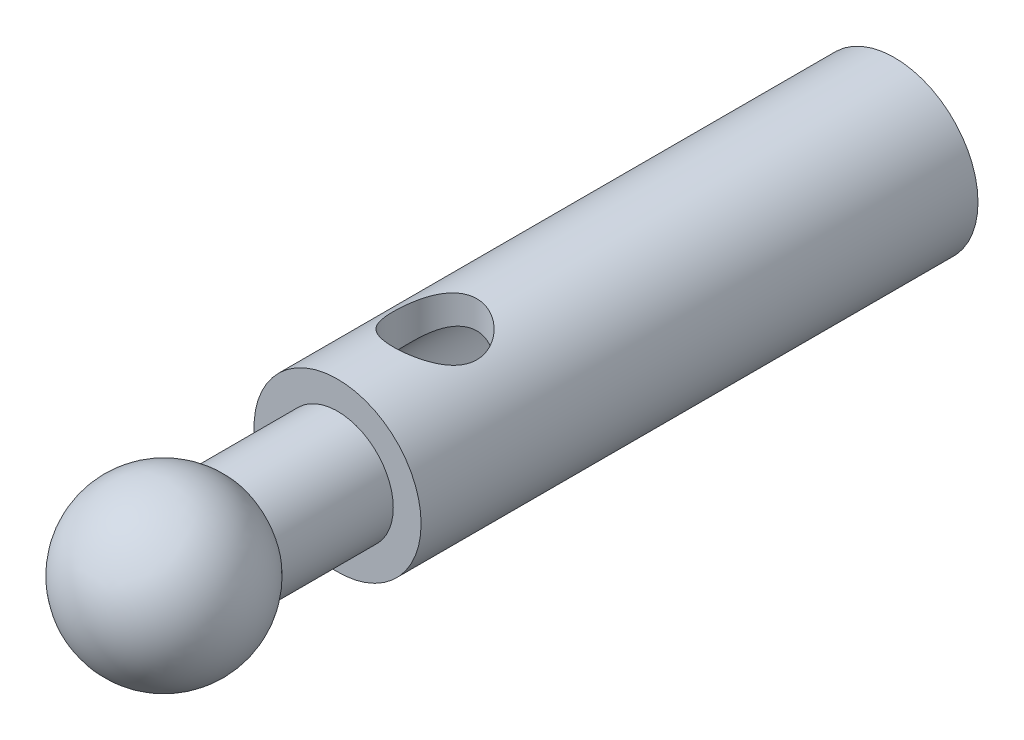
ISO-10303-21;
HEADER;
FILE_DESCRIPTION(('STEP AP214'),'2;1');
FILE_NAME('part.step','',(''),(''),'','','');
FILE_SCHEMA(('AUTOMOTIVE_DESIGN { 1 0 10303 214 1 1 1 1 }'));
ENDSEC;
DATA;
#1=APPLICATION_CONTEXT('core data for automotive mechanical design processes');
#2=APPLICATION_PROTOCOL_DEFINITION('international standard','automotive_design',2000,#1);
#3=PRODUCT_CONTEXT('',#1,'mechanical');
#4=PRODUCT('Part','Part','',(#3));
#5=PRODUCT_RELATED_PRODUCT_CATEGORY('part','',(#4));
#6=PRODUCT_DEFINITION_FORMATION('','',#4);
#7=PRODUCT_DEFINITION_CONTEXT('part definition',#1,'design');
#8=PRODUCT_DEFINITION('design','',#6,#7);
#9=PRODUCT_DEFINITION_SHAPE('','',#8);
#10=(LENGTH_UNIT() NAMED_UNIT(*) SI_UNIT(.MILLI.,.METRE.));
#11=(NAMED_UNIT(*) PLANE_ANGLE_UNIT() SI_UNIT($,.RADIAN.));
#12=(NAMED_UNIT(*) SI_UNIT($,.STERADIAN.) SOLID_ANGLE_UNIT());
#13=UNCERTAINTY_MEASURE_WITH_UNIT(LENGTH_MEASURE(1.E-05),#10,'distance_accuracy_value','');
#14=(GEOMETRIC_REPRESENTATION_CONTEXT(3) GLOBAL_UNCERTAINTY_ASSIGNED_CONTEXT((#13)) GLOBAL_UNIT_ASSIGNED_CONTEXT((#10,
#11,#12)) REPRESENTATION_CONTEXT('',''));
#15=CARTESIAN_POINT('',(0.,0.,0.));
#16=DIRECTION('',(0.,0.,1.));
#17=DIRECTION('',(1.,0.,0.));
#18=AXIS2_PLACEMENT_3D('',#15,#16,#17);
#19=CARTESIAN_POINT('',(0.,0.,6.22880016650845));
#20=DIRECTION('',(0.,0.,1.));
#21=DIRECTION('',(1.,0.,0.));
#22=AXIS2_PLACEMENT_3D('',#19,#20,#21);
#23=CYLINDRICAL_SURFACE('',#22,1.);
#24=CARTESIAN_POINT('',(0.,0.,-8.38923382224144));
#25=DIRECTION('',(0.,0.,1.));
#26=DIRECTION('',(1.,0.,0.));
#27=AXIS2_PLACEMENT_3D('',#24,#25,#26);
#28=CIRCLE('',#27,1.);
#29=CARTESIAN_POINT('',(1.,0.,-8.38923382224144));
#30=VERTEX_POINT('',#29);
#31=EDGE_CURVE('E11',#30,#30,#28,.T.);
#32=ORIENTED_EDGE('',*,*,#31,.F.);
#33=EDGE_LOOP('',(#32));
#34=FACE_BOUND('',#33,.T.);
#35=CARTESIAN_POINT('',(0.,0.,0.610766177758557));
#36=DIRECTION('',(0.,0.,1.));
#37=DIRECTION('',(1.,0.,0.));
#38=AXIS2_PLACEMENT_3D('',#35,#36,#37);
#39=CIRCLE('',#38,1.);
#40=CARTESIAN_POINT('',(0.,-1.,0.610766177758557));
#41=VERTEX_POINT('',#40);
#42=CARTESIAN_POINT('',(0.,1.,0.610766177758557));
#43=VERTEX_POINT('',#42);
#44=EDGE_CURVE('E83',#41,#43,#39,.T.);
#45=ORIENTED_EDGE('',*,*,#44,.T.);
#46=CARTESIAN_POINT('',(0.,1.,0.610766177758557));
#47=CARTESIAN_POINT('',(0.036620214401237,0.99999554992433,0.610761442410487));
#48=CARTESIAN_POINT('',(0.0732831719538218,0.997967650692159,0.60806303813198));
#49=CARTESIAN_POINT('',(0.145465550551889,0.990033614797006,0.59743327507231));
#50=CARTESIAN_POINT('',(0.180981860536907,0.984117727976347,0.589488760040905));
#51=CARTESIAN_POINT('',(0.249618016635632,0.968978221133336,0.56890955602082));
#52=CARTESIAN_POINT('',(0.282750996692573,0.959774718373226,0.556303376073267));
#53=CARTESIAN_POINT('',(0.346210978824909,0.938752824883223,0.526995050552521));
#54=CARTESIAN_POINT('',(0.376538798175683,0.92693519919514,0.510294103187685));
#55=CARTESIAN_POINT('',(0.436733026399873,0.900247710135604,0.47163465827731));
#56=CARTESIAN_POINT('',(0.466296630176022,0.885196539347366,0.449332509399509));
#57=CARTESIAN_POINT('',(0.521513568274129,0.853835092817012,0.401018262775736));
#58=CARTESIAN_POINT('',(0.547160736840209,0.837522891380571,0.375000437432701));
#59=CARTESIAN_POINT('',(0.599185812622843,0.801355617071727,0.313974699827026));
#60=CARTESIAN_POINT('',(0.624652893542544,0.781454274009926,0.278214338856543));
#61=CARTESIAN_POINT('',(0.669309989447193,0.743557223633514,0.202040671915976));
#62=CARTESIAN_POINT('',(0.688508584605922,0.725558934483915,0.161633829331437));
#63=CARTESIAN_POINT('',(0.714403139262061,0.699885775857878,0.091014758372502));
#64=CARTESIAN_POINT('',(0.723128372337556,0.690788755925943,0.0620708291823348));
#65=CARTESIAN_POINT('',(0.737103362769486,0.675857970761134,0.00256981037809932));
#66=CARTESIAN_POINT('',(0.742361076759835,0.670016739542134,-0.0279834111785993));
#67=CARTESIAN_POINT('',(0.749064110723877,0.662518798434897,-0.0903251150070697));
#68=CARTESIAN_POINT('',(0.75047477428221,0.660900133439582,-0.122122225592224));
#69=CARTESIAN_POINT('',(0.749241066198165,0.662297658823726,-0.185541277693482));
#70=CARTESIAN_POINT('',(0.746595240758687,0.665315510876205,-0.217163152330419));
#71=CARTESIAN_POINT('',(0.737988696485992,0.674838116502368,-0.27582949590356));
#72=CARTESIAN_POINT('',(0.732412431994233,0.680935785974532,-0.30300200760013));
#73=CARTESIAN_POINT('',(0.718528355694915,0.695570964919253,-0.355953261437209));
#74=CARTESIAN_POINT('',(0.710217918434355,0.704110818431618,-0.381730636102054));
#75=CARTESIAN_POINT('',(0.685165320811545,0.728708846105991,-0.447362015654333));
#76=CARTESIAN_POINT('',(0.666400742456175,0.746128245598029,-0.485934030588921));
#77=CARTESIAN_POINT('',(0.623090116586356,0.782666490824355,-0.558832084150201));
#78=CARTESIAN_POINT('',(0.59853002128312,0.801789394457195,-0.593147491861789));
#79=CARTESIAN_POINT('',(0.543258020506856,0.840258361538408,-0.658110517450432));
#80=CARTESIAN_POINT('',(0.512406877629168,0.859597933643939,-0.688644125684089));
#81=CARTESIAN_POINT('',(0.445211260855809,0.896240189912108,-0.744365645630127));
#82=CARTESIAN_POINT('',(0.408877527147122,0.913546741320541,-0.769563782356177));
#83=CARTESIAN_POINT('',(0.338951040226877,0.941398630366827,-0.809224221861975));
#84=CARTESIAN_POINT('',(0.306269935092758,0.95260385472467,-0.824826119349432));
#85=CARTESIAN_POINT('',(0.238176086601096,0.971864522085111,-0.851346262473279));
#86=CARTESIAN_POINT('',(0.202765070531897,0.979921937521859,-0.862267441491059));
#87=CARTESIAN_POINT('',(0.129838116241745,0.992227943179847,-0.878860503684691));
#88=CARTESIAN_POINT('',(0.0923106407029679,0.996452964858721,-0.884499911710765));
#89=CARTESIAN_POINT('',(0.0166006198984625,1.00057941829725,-0.890008620927291));
#90=CARTESIAN_POINT('',(-0.0215816421863606,1.00048267422705,-0.889880356589126));
#91=CARTESIAN_POINT('',(-0.0934021086648135,0.996212735879362,-0.884178387604852));
#92=CARTESIAN_POINT('',(-0.127111163773067,0.992450433002005,-0.87915355379711));
#93=CARTESIAN_POINT('',(-0.193055335304559,0.981756601007941,-0.864746932237511));
#94=CARTESIAN_POINT('',(-0.225290136493631,0.974824397536311,-0.85536421739674));
#95=CARTESIAN_POINT('',(-0.288708389844884,0.957999153416568,-0.832290056944894));
#96=CARTESIAN_POINT('',(-0.319814586268068,0.948010251450969,-0.818458231527746));
#97=CARTESIAN_POINT('',(-0.379259263521538,0.925834927059814,-0.78714759452865));
#98=CARTESIAN_POINT('',(-0.407597360668207,0.913648200660337,-0.769668278421579));
#99=CARTESIAN_POINT('',(-0.465755813159512,0.885595734432499,-0.72834219903616));
#100=CARTESIAN_POINT('',(-0.495033381349326,0.869455475125194,-0.703919552522708));
#101=CARTESIAN_POINT('',(-0.549359874279295,0.836194764373917,-0.651229445947259));
#102=CARTESIAN_POINT('',(-0.574399152347978,0.819072192536945,-0.6229534723948));
#103=CARTESIAN_POINT('',(-0.62438770537802,0.78184564145752,-0.557158881760816));
#104=CARTESIAN_POINT('',(-0.648415218243071,0.761793592600651,-0.518905041495127));
#105=CARTESIAN_POINT('',(-0.689616179991865,0.724702956742107,-0.437553783255385));
#106=CARTESIAN_POINT('',(-0.706810002579291,0.707655497854298,-0.394471261287782));
#107=CARTESIAN_POINT('',(-0.7280786712828,0.685594389043249,-0.321526597803825));
#108=CARTESIAN_POINT('',(-0.734655047561808,0.678479059123849,-0.293038259039086));
#109=CARTESIAN_POINT('',(-0.744457610912695,0.667710280514031,-0.234880298751018));
#110=CARTESIAN_POINT('',(-0.747691276007806,0.664049106097414,-0.205213468844592));
#111=CARTESIAN_POINT('',(-0.750576601033655,0.660788008964816,-0.145319282331485));
#112=CARTESIAN_POINT('',(-0.750210076582722,0.661208703438971,-0.115089850720612));
#113=CARTESIAN_POINT('',(-0.74588441923474,0.666082242704223,-0.0552054028814332));
#114=CARTESIAN_POINT('',(-0.741920650285916,0.670540290734721,-0.0255511783528203));
#115=CARTESIAN_POINT('',(-0.729469208900038,0.684086744053067,0.0387234635370604));
#116=CARTESIAN_POINT('',(-0.720182838954333,0.693973530017118,0.0730147681254315));
#117=CARTESIAN_POINT('',(-0.697348137148892,0.716914816662479,0.139033601872546));
#118=CARTESIAN_POINT('',(-0.683789039566413,0.729977299739552,0.170754397644588));
#119=CARTESIAN_POINT('',(-0.647494590522783,0.762582387984413,0.242026494527841));
#120=CARTESIAN_POINT('',(-0.62320769235656,0.782801021766623,0.280476975753205));
#121=CARTESIAN_POINT('',(-0.568253610319043,0.823567545090072,0.35232919362465));
#122=CARTESIAN_POINT('',(-0.53758074162965,0.844115712838232,0.385726385757233));
#123=CARTESIAN_POINT('',(-0.469813504073434,0.883644966812503,0.447182124079668));
#124=CARTESIAN_POINT('',(-0.432668324359604,0.902611751461283,0.475194431847497));
#125=CARTESIAN_POINT('',(-0.352579805271569,0.936786365634489,0.524377609158534));
#126=CARTESIAN_POINT('',(-0.309650664114992,0.952003149546711,0.545564813866366));
#127=CARTESIAN_POINT('',(-0.232419470733685,0.973183741180645,0.574666136544611));
#128=CARTESIAN_POINT('',(-0.199274632668579,0.980552315625431,0.584650344057896));
#129=CARTESIAN_POINT('',(-0.131422973804691,0.99191799869998,0.59997433070259));
#130=CARTESIAN_POINT('',(-0.0967208035042921,0.995924522226517,0.605327080822991));
#131=CARTESIAN_POINT('',(-0.0412269601856738,0.999363449511956,0.609917446258469));
#132=CARTESIAN_POINT('',(-0.0206202562409953,1.00000250576634,0.610768844157216));
#133=CARTESIAN_POINT('',(0.,1.,0.610766177758557));
#134=B_SPLINE_CURVE_WITH_KNOTS('',3,(#46,#47,#48,#49,#50,#51,#52,#53,#54,#55,#56,#57,#58,#59,
#60,#61,#62,#63,#64,#65,#66,#67,#68,#69,#70,#71,#72,#73,#74,#75,#76,#77,#78,#79,#80,#81,#82,#83,
#84,#85,#86,#87,#88,#89,#90,#91,#92,#93,#94,#95,#96,#97,#98,#99,#100,#101,#102,#103,#104,#105,
#106,#107,#108,#109,#110,#111,#112,#113,#114,#115,#116,#117,#118,#119,#120,#121,#122,#123,#124,
#125,#126,#127,#128,#129,#130,#131,#132,#133),.UNSPECIFIED.,.T.,.F.,(4,2,2,2,2,2,2,2,2,2,2,2,2,
2,2,2,2,2,2,2,2,2,2,2,2,2,2,2,2,2,2,2,2,2,2,2,2,2,2,2,2,2,2,4),(0.,0.109785893286021,
0.219848159711622,0.329248166786691,0.438616199424647,0.558112156587149,0.677794342025813,
0.821800079437256,0.965607870282534,1.05999759264951,1.15416996597645,1.24918793810628,
1.34423997150105,1.42913445078177,1.51411068794507,1.65224665897142,1.79072096173131,
1.93267941963232,2.07436331241032,2.18763252497381,2.30083064815745,2.41472029077636,
2.52856186227493,2.63095593500184,2.73337180087093,2.83940219736027,2.94544726982957,
3.06920191035121,3.19323454486913,3.3408429800216,3.48800797919243,3.57794580705653,
3.66768199551291,3.75787166921557,3.84817774276114,3.95819835474254,4.06849842564148,
4.21706123322071,4.36575686189633,4.51567724740512,4.66523610130769,4.77097848765002,
4.87642376135815,4.93824243959964),.UNSPECIFIED.);
#135=EDGE_CURVE('E49',#43,#43,#134,.T.);
#136=ORIENTED_EDGE('',*,*,#135,.T.);
#137=EDGE_CURVE('E84',#43,#41,#39,.T.);
#138=ORIENTED_EDGE('',*,*,#137,.T.);
#139=CARTESIAN_POINT('',(0.,-1.,0.610766177758557));
#140=CARTESIAN_POINT('',(-0.036620214401237,-0.99999554992433,0.610761442410487));
#141=CARTESIAN_POINT('',(-0.0732831719538218,-0.997967650692159,0.60806303813198));
#142=CARTESIAN_POINT('',(-0.145465550551889,-0.990033614797006,0.59743327507231));
#143=CARTESIAN_POINT('',(-0.180981860536907,-0.984117727976347,0.589488760040905));
#144=CARTESIAN_POINT('',(-0.249618016635632,-0.968978221133336,0.56890955602082));
#145=CARTESIAN_POINT('',(-0.282750996692573,-0.959774718373226,0.556303376073267));
#146=CARTESIAN_POINT('',(-0.346210978824909,-0.938752824883223,0.526995050552521));
#147=CARTESIAN_POINT('',(-0.376538798175683,-0.92693519919514,0.510294103187685));
#148=CARTESIAN_POINT('',(-0.436733026399873,-0.900247710135604,0.47163465827731));
#149=CARTESIAN_POINT('',(-0.466296630176022,-0.885196539347366,0.449332509399509));
#150=CARTESIAN_POINT('',(-0.521513568274129,-0.853835092817012,0.401018262775736));
#151=CARTESIAN_POINT('',(-0.547160736840209,-0.837522891380571,0.375000437432701));
#152=CARTESIAN_POINT('',(-0.599185812622843,-0.801355617071727,0.313974699827026));
#153=CARTESIAN_POINT('',(-0.624652893542544,-0.781454274009926,0.278214338856543));
#154=CARTESIAN_POINT('',(-0.669309989447193,-0.743557223633514,0.202040671915976));
#155=CARTESIAN_POINT('',(-0.688508584605922,-0.725558934483915,0.161633829331437));
#156=CARTESIAN_POINT('',(-0.714403139262061,-0.699885775857878,0.091014758372502));
#157=CARTESIAN_POINT('',(-0.723128372337556,-0.690788755925943,0.0620708291823348));
#158=CARTESIAN_POINT('',(-0.737103362769486,-0.675857970761134,0.00256981037809932));
#159=CARTESIAN_POINT('',(-0.742361076759835,-0.670016739542134,-0.0279834111785993));
#160=CARTESIAN_POINT('',(-0.749064110723877,-0.662518798434897,-0.0903251150070697));
#161=CARTESIAN_POINT('',(-0.75047477428221,-0.660900133439582,-0.122122225592224));
#162=CARTESIAN_POINT('',(-0.749241066198165,-0.662297658823726,-0.185541277693482));
#163=CARTESIAN_POINT('',(-0.746595240758687,-0.665315510876205,-0.217163152330419));
#164=CARTESIAN_POINT('',(-0.737988696485992,-0.674838116502368,-0.27582949590356));
#165=CARTESIAN_POINT('',(-0.732412431994233,-0.680935785974532,-0.30300200760013));
#166=CARTESIAN_POINT('',(-0.718528355694915,-0.695570964919253,-0.355953261437209));
#167=CARTESIAN_POINT('',(-0.710217918434355,-0.704110818431618,-0.381730636102054));
#168=CARTESIAN_POINT('',(-0.685165320811545,-0.728708846105991,-0.447362015654333));
#169=CARTESIAN_POINT('',(-0.666400742456175,-0.746128245598029,-0.485934030588921));
#170=CARTESIAN_POINT('',(-0.623090116586356,-0.782666490824355,-0.558832084150201));
#171=CARTESIAN_POINT('',(-0.59853002128312,-0.801789394457195,-0.593147491861789));
#172=CARTESIAN_POINT('',(-0.543258020506856,-0.840258361538408,-0.658110517450432));
#173=CARTESIAN_POINT('',(-0.512406877629168,-0.859597933643939,-0.688644125684089));
#174=CARTESIAN_POINT('',(-0.445211260855809,-0.896240189912108,-0.744365645630127));
#175=CARTESIAN_POINT('',(-0.408877527147122,-0.913546741320541,-0.769563782356177));
#176=CARTESIAN_POINT('',(-0.338951040226877,-0.941398630366827,-0.809224221861975));
#177=CARTESIAN_POINT('',(-0.306269935092758,-0.95260385472467,-0.824826119349432));
#178=CARTESIAN_POINT('',(-0.238176086601096,-0.971864522085111,-0.851346262473279));
#179=CARTESIAN_POINT('',(-0.202765070531897,-0.979921937521859,-0.862267441491059));
#180=CARTESIAN_POINT('',(-0.129838116241745,-0.992227943179847,-0.878860503684691));
#181=CARTESIAN_POINT('',(-0.0923106407029679,-0.996452964858721,-0.884499911710765));
#182=CARTESIAN_POINT('',(-0.0166006198984625,-1.00057941829725,-0.890008620927291));
#183=CARTESIAN_POINT('',(0.0215816421863606,-1.00048267422705,-0.889880356589126));
#184=CARTESIAN_POINT('',(0.0934021086648135,-0.996212735879362,-0.884178387604852));
#185=CARTESIAN_POINT('',(0.127111163773067,-0.992450433002005,-0.87915355379711));
#186=CARTESIAN_POINT('',(0.193055335304559,-0.981756601007941,-0.864746932237511));
#187=CARTESIAN_POINT('',(0.225290136493631,-0.974824397536311,-0.85536421739674));
#188=CARTESIAN_POINT('',(0.288708389844884,-0.957999153416568,-0.832290056944894));
#189=CARTESIAN_POINT('',(0.319814586268068,-0.948010251450969,-0.818458231527746));
#190=CARTESIAN_POINT('',(0.379259263521538,-0.925834927059814,-0.78714759452865));
#191=CARTESIAN_POINT('',(0.407597360668207,-0.913648200660337,-0.769668278421579));
#192=CARTESIAN_POINT('',(0.465755813159512,-0.885595734432499,-0.72834219903616));
#193=CARTESIAN_POINT('',(0.495033381349326,-0.869455475125194,-0.703919552522708));
#194=CARTESIAN_POINT('',(0.549359874279295,-0.836194764373917,-0.651229445947259));
#195=CARTESIAN_POINT('',(0.574399152347978,-0.819072192536945,-0.6229534723948));
#196=CARTESIAN_POINT('',(0.62438770537802,-0.78184564145752,-0.557158881760816));
#197=CARTESIAN_POINT('',(0.648415218243071,-0.761793592600651,-0.518905041495127));
#198=CARTESIAN_POINT('',(0.689616179991865,-0.724702956742107,-0.437553783255385));
#199=CARTESIAN_POINT('',(0.706810002579291,-0.707655497854298,-0.394471261287782));
#200=CARTESIAN_POINT('',(0.7280786712828,-0.685594389043249,-0.321526597803825));
#201=CARTESIAN_POINT('',(0.734655047561808,-0.678479059123849,-0.293038259039086));
#202=CARTESIAN_POINT('',(0.744457610912695,-0.667710280514031,-0.234880298751018));
#203=CARTESIAN_POINT('',(0.747691276007806,-0.664049106097414,-0.205213468844592));
#204=CARTESIAN_POINT('',(0.750576601033655,-0.660788008964816,-0.145319282331485));
#205=CARTESIAN_POINT('',(0.750210076582722,-0.661208703438971,-0.115089850720612));
#206=CARTESIAN_POINT('',(0.74588441923474,-0.666082242704223,-0.0552054028814332));
#207=CARTESIAN_POINT('',(0.741920650285916,-0.670540290734721,-0.0255511783528203));
#208=CARTESIAN_POINT('',(0.729469208900038,-0.684086744053067,0.0387234635370604));
#209=CARTESIAN_POINT('',(0.720182838954333,-0.693973530017118,0.0730147681254315));
#210=CARTESIAN_POINT('',(0.697348137148892,-0.716914816662479,0.139033601872546));
#211=CARTESIAN_POINT('',(0.683789039566413,-0.729977299739552,0.170754397644588));
#212=CARTESIAN_POINT('',(0.647494590522783,-0.762582387984413,0.242026494527841));
#213=CARTESIAN_POINT('',(0.62320769235656,-0.782801021766623,0.280476975753205));
#214=CARTESIAN_POINT('',(0.568253610319043,-0.823567545090072,0.35232919362465));
#215=CARTESIAN_POINT('',(0.53758074162965,-0.844115712838232,0.385726385757233));
#216=CARTESIAN_POINT('',(0.469813504073434,-0.883644966812503,0.447182124079668));
#217=CARTESIAN_POINT('',(0.432668324359604,-0.902611751461283,0.475194431847497));
#218=CARTESIAN_POINT('',(0.352579805271569,-0.936786365634489,0.524377609158534));
#219=CARTESIAN_POINT('',(0.309650664114992,-0.952003149546711,0.545564813866366));
#220=CARTESIAN_POINT('',(0.232419470733685,-0.973183741180645,0.574666136544611));
#221=CARTESIAN_POINT('',(0.199274632668579,-0.980552315625431,0.584650344057896));
#222=CARTESIAN_POINT('',(0.131422973804691,-0.99191799869998,0.59997433070259));
#223=CARTESIAN_POINT('',(0.0967208035042921,-0.995924522226517,0.605327080822991));
#224=CARTESIAN_POINT('',(0.0412269601856738,-0.999363449511956,0.609917446258469));
#225=CARTESIAN_POINT('',(0.0206202562409953,-1.00000250576634,0.610768844157216));
#226=CARTESIAN_POINT('',(0.,-1.,0.610766177758557));
#227=B_SPLINE_CURVE_WITH_KNOTS('',3,(#139,#140,#141,#142,#143,#144,#145,#146,#147,#148,#149,
#150,#151,#152,#153,#154,#155,#156,#157,#158,#159,#160,#161,#162,#163,#164,#165,#166,#167,#168,
#169,#170,#171,#172,#173,#174,#175,#176,#177,#178,#179,#180,#181,#182,#183,#184,#185,#186,#187,
#188,#189,#190,#191,#192,#193,#194,#195,#196,#197,#198,#199,#200,#201,#202,#203,#204,#205,#206,
#207,#208,#209,#210,#211,#212,#213,#214,#215,#216,#217,#218,#219,#220,#221,#222,#223,#224,#225,
#226),.UNSPECIFIED.,.T.,.F.,(4,2,2,2,2,2,2,2,2,2,2,2,2,2,2,2,2,2,2,2,2,2,2,2,2,2,2,2,2,2,2,2,2,
2,2,2,2,2,2,2,2,2,2,4),(0.,0.109785893286021,0.219848159711622,0.329248166786691,
0.438616199424647,0.558112156587149,0.677794342025813,0.821800079437256,0.965607870282534,
1.05999759264951,1.15416996597645,1.24918793810628,1.34423997150105,1.42913445078177,
1.51411068794507,1.65224665897142,1.79072096173131,1.93267941963232,2.07436331241032,
2.18763252497381,2.30083064815745,2.41472029077636,2.52856186227493,2.63095593500184,
2.73337180087093,2.83940219736027,2.94544726982957,3.06920191035121,3.19323454486913,
3.3408429800216,3.48800797919243,3.57794580705653,3.66768199551291,3.75787166921557,
3.84817774276114,3.95819835474254,4.06849842564148,4.21706123322071,4.36575686189633,
4.51567724740512,4.66523610130769,4.77097848765002,4.87642376135815,4.93824243959964),.UNSPECIFIED.);
#228=EDGE_CURVE('E45',#41,#41,#227,.T.);
#229=ORIENTED_EDGE('',*,*,#228,.T.);
#230=EDGE_LOOP('',(#45,#136,#138,#229));
#231=FACE_BOUND('',#230,.T.);
#232=ADVANCED_FACE('F32',(#34,#231),#23,.F.);
#233=CARTESIAN_POINT('',(0.,1.5,-8.38923382224144));
#234=DIRECTION('',(0.,0.,1.));
#235=DIRECTION('',(1.,0.,0.));
#236=AXIS2_PLACEMENT_3D('',#233,#234,#235);
#237=PLANE('',#236);
#238=CARTESIAN_POINT('',(0.,0.,-8.38923382224144));
#239=DIRECTION('',(0.,0.,1.));
#240=DIRECTION('',(1.,0.,0.));
#241=AXIS2_PLACEMENT_3D('',#238,#239,#240);
#242=CIRCLE('',#241,1.5);
#243=CARTESIAN_POINT('',(1.5,0.,-8.38923382224144));
#244=VERTEX_POINT('',#243);
#245=EDGE_CURVE('E40',#244,#244,#242,.T.);
#246=ORIENTED_EDGE('',*,*,#245,.F.);
#247=EDGE_LOOP('',(#246));
#248=FACE_BOUND('',#247,.T.);
#249=ORIENTED_EDGE('',*,*,#31,.T.);
#250=EDGE_LOOP('',(#249));
#251=FACE_BOUND('',#250,.T.);
#252=ADVANCED_FACE('F91',(#248,#251),#237,.F.);
#253=CARTESIAN_POINT('',(0.,0.,6.22880016650845));
#254=DIRECTION('',(0.,0.,1.));
#255=DIRECTION('',(1.,0.,0.));
#256=AXIS2_PLACEMENT_3D('',#253,#254,#255);
#257=CYLINDRICAL_SURFACE('',#256,1.5);
#258=CARTESIAN_POINT('',(0.,-1.5,0.610766177758556));
#259=CARTESIAN_POINT('',(0.0394289722147399,-1.49999785053113,0.610763701018931));
#260=CARTESIAN_POINT('',(0.0789049497735245,-1.49842868264638,0.6076386229173));
#261=CARTESIAN_POINT('',(0.156690176451319,-1.49230617028047,0.595276517502868));
#262=CARTESIAN_POINT('',(0.194997065035128,-1.48774715871738,0.586027883010319));
#263=CARTESIAN_POINT('',(0.269200158660431,-1.47612209552484,0.56187082129596));
#264=CARTESIAN_POINT('',(0.305105102204385,-1.4690657938314,0.546984389572547));
#265=CARTESIAN_POINT('',(0.373854462604924,-1.45309332386834,0.512088211734851));
#266=CARTESIAN_POINT('',(0.406699120492538,-1.44417730225147,0.492078869571917));
#267=CARTESIAN_POINT('',(0.47063086332144,-1.42467193693543,0.446128240644582));
#268=CARTESIAN_POINT('',(0.501491408341584,-1.41401399345652,0.419901318328825));
#269=CARTESIAN_POINT('',(0.558584583650233,-1.39244977685058,0.362875068323281));
#270=CARTESIAN_POINT('',(0.584813687330075,-1.38154332156776,0.332072288929226));
#271=CARTESIAN_POINT('',(0.633939000337709,-1.3597421339801,0.26390366561602));
#272=CARTESIAN_POINT('',(0.656419001663728,-1.34891390227599,0.226214103999122));
#273=CARTESIAN_POINT('',(0.694626170168022,-1.3296448407924,0.146990675768895));
#274=CARTESIAN_POINT('',(0.710358161224751,-1.32120230705242,0.105459581216494));
#275=CARTESIAN_POINT('',(0.733599331641442,-1.30843400278356,0.0222673486921142));
#276=CARTESIAN_POINT('',(0.741544392810331,-1.30389203687785,-0.0192371612919896));
#277=CARTESIAN_POINT('',(0.750320244981635,-1.29886417461396,-0.103217950576052));
#278=CARTESIAN_POINT('',(0.751158066279806,-1.29837427007466,-0.14569322789481));
#279=CARTESIAN_POINT('',(0.746015465379221,-1.30133197692936,-0.22494834047797));
#280=CARTESIAN_POINT('',(0.740838419652617,-1.3043157274651,-0.261801845658732));
#281=CARTESIAN_POINT('',(0.7252048867927,-1.31307171550388,-0.334025254271226));
#282=CARTESIAN_POINT('',(0.714746717923239,-1.31884484123832,-0.369394681220431));
#283=CARTESIAN_POINT('',(0.688657335289503,-1.33265607309556,-0.438655671665689));
#284=CARTESIAN_POINT('',(0.672911300336997,-1.34074380497999,-0.472493621330786));
#285=CARTESIAN_POINT('',(0.636781265751002,-1.35827553211053,-0.53720954168395));
#286=CARTESIAN_POINT('',(0.616395182859351,-1.36772013585143,-0.568086173941511));
#287=CARTESIAN_POINT('',(0.568549541184592,-1.38834868427464,-0.630124761798864));
#288=CARTESIAN_POINT('',(0.540520843776962,-1.3996013267756,-0.660826477423562));
#289=CARTESIAN_POINT('',(0.479666684056031,-1.42160717475305,-0.71728538618462));
#290=CARTESIAN_POINT('',(0.446838942430714,-1.43236013969101,-0.743040216266857));
#291=CARTESIAN_POINT('',(0.375387379373887,-1.45276490462223,-0.78999806801374));
#292=CARTESIAN_POINT('',(0.336565193699557,-1.46234238121505,-0.81093417657575));
#293=CARTESIAN_POINT('',(0.255349661616598,-1.47868410840932,-0.845806594023702));
#294=CARTESIAN_POINT('',(0.212959182198958,-1.48545059207664,-0.85974846100282));
#295=CARTESIAN_POINT('',(0.129574868745526,-1.49493250306077,-0.879090375028951));
#296=CARTESIAN_POINT('',(0.0887561479112433,-1.49793703725984,-0.885102249051528));
#297=CARTESIAN_POINT('',(0.00658469996201532,-1.50054760094326,-0.890332370592312));
#298=CARTESIAN_POINT('',(-0.034767764902426,-1.50015524040984,-0.889553836471054));
#299=CARTESIAN_POINT('',(-0.113424728989495,-1.49618394190081,-0.881578805927379));
#300=CARTESIAN_POINT('',(-0.150794556037466,-1.49285434266142,-0.874884422693922));
#301=CARTESIAN_POINT('',(-0.223805169226438,-1.48366628486114,-0.856055268320131));
#302=CARTESIAN_POINT('',(-0.259445764268248,-1.47780754750749,-0.843919897401426));
#303=CARTESIAN_POINT('',(-0.329166456337249,-1.46388188560252,-0.814234972416566));
#304=CARTESIAN_POINT('',(-0.363172797754615,-1.45575661327454,-0.796540534653835));
#305=CARTESIAN_POINT('',(-0.427846021274191,-1.43807980737832,-0.756403170506913));
#306=CARTESIAN_POINT('',(-0.458511472331462,-1.42852766674339,-0.733958221296371));
#307=CARTESIAN_POINT('',(-0.51882576696799,-1.40781166003098,-0.68241350324179));
#308=CARTESIAN_POINT('',(-0.548079058368479,-1.39658163636331,-0.652876670901271));
#309=CARTESIAN_POINT('',(-0.60139224083493,-1.37446793702906,-0.589289958789467));
#310=CARTESIAN_POINT('',(-0.625448539268131,-1.36358450536145,-0.555236983129164));
#311=CARTESIAN_POINT('',(-0.668780935873272,-1.34288394169551,-0.481501081591211));
#312=CARTESIAN_POINT('',(-0.687769121908978,-1.33314397247604,-0.441625372584999));
#313=CARTESIAN_POINT('',(-0.718562119510353,-1.31680554276095,-0.358601271472054));
#314=CARTESIAN_POINT('',(-0.730376186915678,-1.31020303680463,-0.315457177365554));
#315=CARTESIAN_POINT('',(-0.74539626558726,-1.301711257565,-0.231551155095358));
#316=CARTESIAN_POINT('',(-0.749319747300649,-1.29943037595368,-0.190958132169668));
#317=CARTESIAN_POINT('',(-0.750516865785591,-1.29874015984631,-0.109648521863398));
#318=CARTESIAN_POINT('',(-0.7477933849683,-1.30032914720664,-0.0689319956868694));
#319=CARTESIAN_POINT('',(-0.736444594194198,-1.30678396537518,0.00737880390756694));
#320=CARTESIAN_POINT('',(-0.7284062357571,-1.31132320861795,0.0430915303668556));
#321=CARTESIAN_POINT('',(-0.707381518668484,-1.32278262140938,0.112622267327085));
#322=CARTESIAN_POINT('',(-0.694393568369858,-1.32970355677257,0.146439664327531));
#323=CARTESIAN_POINT('',(-0.662861808975513,-1.34571397773396,0.21373481599851));
#324=CARTESIAN_POINT('',(-0.644003353362344,-1.35491791797143,0.247037104130831));
#325=CARTESIAN_POINT('',(-0.601613228727477,-1.37426498725943,0.310222079893995));
#326=CARTESIAN_POINT('',(-0.578079128428987,-1.38440860345891,0.340102975647423));
#327=CARTESIAN_POINT('',(-0.523652494998482,-1.40596742369485,0.399372664526768));
#328=CARTESIAN_POINT('',(-0.492213317257629,-1.41738737483601,0.428260504529997));
#329=CARTESIAN_POINT('',(-0.424616104665211,-1.43908314191316,0.48046341532628));
#330=CARTESIAN_POINT('',(-0.38845554244259,-1.4493583395603,0.503775482328273));
#331=CARTESIAN_POINT('',(-0.311948697614961,-1.46773507188827,0.544193449830209));
#332=CARTESIAN_POINT('',(-0.271574627950962,-1.47582072422182,0.561254304817132));
#333=CARTESIAN_POINT('',(-0.188056575970644,-1.48876006022599,0.58812230369777));
#334=CARTESIAN_POINT('',(-0.144920849717375,-1.49362292529699,0.59795006288074));
#335=CARTESIAN_POINT('',(-0.084451459862538,-1.49771596432247,0.606189236065443));
#336=CARTESIAN_POINT('',(-0.067621409579624,-1.49857024004401,0.607903158406271));
#337=CARTESIAN_POINT('',(-0.0338637988553681,-1.49971272733399,0.610192176896161));
#338=CARTESIAN_POINT('',(-0.016936235735536,-1.50000092327822,0.610767241611957));
#339=CARTESIAN_POINT('',(0.,-1.5,0.610766177758556));
#340=B_SPLINE_CURVE_WITH_KNOTS('',3,(#258,#259,#260,#261,#262,#263,#264,#265,#266,#267,#268,
#269,#270,#271,#272,#273,#274,#275,#276,#277,#278,#279,#280,#281,#282,#283,#284,#285,#286,#287,
#288,#289,#290,#291,#292,#293,#294,#295,#296,#297,#298,#299,#300,#301,#302,#303,#304,#305,#306,
#307,#308,#309,#310,#311,#312,#313,#314,#315,#316,#317,#318,#319,#320,#321,#322,#323,#324,#325,
#326,#327,#328,#329,#330,#331,#332,#333,#334,#335,#336,#337,#338,#339),.UNSPECIFIED.,.T.,.F.,(4,
2,2,2,2,2,2,2,2,2,2,2,2,2,2,2,2,2,2,2,2,2,2,2,2,2,2,2,2,2,2,2,2,2,2,2,2,2,2,2,4),(0.,
0.118218193065219,0.236661112281898,0.354646616619224,0.472622820436176,0.597736319038567,
0.722944678240527,0.857862948230646,0.992684609237108,1.11943509105172,1.24606017996765,
1.35754284306991,1.46906102944259,1.58317680126366,1.69734390945166,1.82598706000409,
1.95469150949015,2.08937266660831,2.2239466268421,2.34737467853509,2.47074423383607,
2.58455179879592,2.69837191223199,2.81544642020924,2.93257088061255,3.06119707983314,
3.18991191461574,3.32486011619756,3.45963383955583,3.5814698062378,3.70325294895004,
3.81343447683137,3.92365146587759,4.04127342581711,4.15895670854218,4.29093932064374,
4.4229928753243,4.55598010247194,4.68858681468698,4.73936460103273,4.79014378886135),.UNSPECIFIED.);
#341=CARTESIAN_POINT('',(0.,-1.5,0.610766177758556));
#342=VERTEX_POINT('',#341);
#343=EDGE_CURVE('E58',#342,#342,#340,.T.);
#344=ORIENTED_EDGE('',*,*,#343,.T.);
#345=EDGE_LOOP('',(#344));
#346=FACE_BOUND('',#345,.T.);
#347=CARTESIAN_POINT('',(0.,1.5,0.610766177758556));
#348=CARTESIAN_POINT('',(-0.0394289722147399,1.49999785053113,0.610763701018931));
#349=CARTESIAN_POINT('',(-0.0789049497735244,1.49842868264638,0.6076386229173));
#350=CARTESIAN_POINT('',(-0.156690176451319,1.49230617028047,0.595276517502868));
#351=CARTESIAN_POINT('',(-0.194997065035128,1.48774715871738,0.586027883010319));
#352=CARTESIAN_POINT('',(-0.269200158660431,1.47612209552484,0.561870821295961));
#353=CARTESIAN_POINT('',(-0.305105102204385,1.4690657938314,0.546984389572547));
#354=CARTESIAN_POINT('',(-0.373854462604924,1.45309332386834,0.512088211734851));
#355=CARTESIAN_POINT('',(-0.406699120492538,1.44417730225147,0.492078869571917));
#356=CARTESIAN_POINT('',(-0.470630863321439,1.42467193693543,0.446128240644582));
#357=CARTESIAN_POINT('',(-0.501491408341584,1.41401399345652,0.419901318328825));
#358=CARTESIAN_POINT('',(-0.558584583650233,1.39244977685058,0.362875068323282));
#359=CARTESIAN_POINT('',(-0.584813687330075,1.38154332156776,0.332072288929226));
#360=CARTESIAN_POINT('',(-0.633939000337709,1.3597421339801,0.26390366561602));
#361=CARTESIAN_POINT('',(-0.656419001663728,1.34891390227599,0.226214103999122));
#362=CARTESIAN_POINT('',(-0.694626170168022,1.3296448407924,0.146990675768895));
#363=CARTESIAN_POINT('',(-0.710358161224751,1.32120230705242,0.105459581216494));
#364=CARTESIAN_POINT('',(-0.733599331641442,1.30843400278356,0.0222673486921142));
#365=CARTESIAN_POINT('',(-0.741544392810331,1.30389203687785,-0.0192371612919895));
#366=CARTESIAN_POINT('',(-0.750320244981635,1.29886417461396,-0.103217950576052));
#367=CARTESIAN_POINT('',(-0.751158066279806,1.29837427007466,-0.14569322789481));
#368=CARTESIAN_POINT('',(-0.746015465379221,1.30133197692936,-0.22494834047797));
#369=CARTESIAN_POINT('',(-0.740838419652617,1.3043157274651,-0.261801845658732));
#370=CARTESIAN_POINT('',(-0.7252048867927,1.31307171550388,-0.334025254271226));
#371=CARTESIAN_POINT('',(-0.714746717923239,1.31884484123832,-0.369394681220431));
#372=CARTESIAN_POINT('',(-0.688657335289503,1.33265607309556,-0.438655671665689));
#373=CARTESIAN_POINT('',(-0.672911300336997,1.34074380497999,-0.472493621330786));
#374=CARTESIAN_POINT('',(-0.636781265751002,1.35827553211053,-0.53720954168395));
#375=CARTESIAN_POINT('',(-0.616395182859351,1.36772013585143,-0.568086173941511));
#376=CARTESIAN_POINT('',(-0.568549541184592,1.38834868427464,-0.630124761798864));
#377=CARTESIAN_POINT('',(-0.540520843776962,1.3996013267756,-0.660826477423562));
#378=CARTESIAN_POINT('',(-0.479666684056031,1.42160717475305,-0.71728538618462));
#379=CARTESIAN_POINT('',(-0.446838942430715,1.43236013969101,-0.743040216266856));
#380=CARTESIAN_POINT('',(-0.375387379373887,1.45276490462223,-0.78999806801374));
#381=CARTESIAN_POINT('',(-0.336565193699557,1.46234238121505,-0.81093417657575));
#382=CARTESIAN_POINT('',(-0.255349661616598,1.47868410840932,-0.845806594023702));
#383=CARTESIAN_POINT('',(-0.212959182198958,1.48545059207664,-0.85974846100282));
#384=CARTESIAN_POINT('',(-0.129574868745527,1.49493250306077,-0.879090375028951));
#385=CARTESIAN_POINT('',(-0.0887561479112434,1.49793703725984,-0.885102249051528));
#386=CARTESIAN_POINT('',(-0.00658469996201537,1.50054760094326,-0.890332370592312));
#387=CARTESIAN_POINT('',(0.0347677649024259,1.50015524040984,-0.889553836471054));
#388=CARTESIAN_POINT('',(0.113424728989495,1.49618394190081,-0.881578805927379));
#389=CARTESIAN_POINT('',(0.150794556037466,1.49285434266142,-0.874884422693922));
#390=CARTESIAN_POINT('',(0.223805169226438,1.48366628486114,-0.856055268320131));
#391=CARTESIAN_POINT('',(0.259445764268248,1.47780754750749,-0.843919897401425));
#392=CARTESIAN_POINT('',(0.329166456337249,1.46388188560252,-0.814234972416566));
#393=CARTESIAN_POINT('',(0.363172797754615,1.45575661327454,-0.796540534653835));
#394=CARTESIAN_POINT('',(0.427846021274191,1.43807980737832,-0.756403170506913));
#395=CARTESIAN_POINT('',(0.458511472331462,1.42852766674339,-0.733958221296371));
#396=CARTESIAN_POINT('',(0.51882576696799,1.40781166003098,-0.682413503241789));
#397=CARTESIAN_POINT('',(0.548079058368479,1.39658163636331,-0.652876670901271));
#398=CARTESIAN_POINT('',(0.60139224083493,1.37446793702906,-0.589289958789467));
#399=CARTESIAN_POINT('',(0.625448539268131,1.36358450536145,-0.555236983129164));
#400=CARTESIAN_POINT('',(0.668780935873272,1.34288394169551,-0.481501081591211));
#401=CARTESIAN_POINT('',(0.687769121908978,1.33314397247604,-0.441625372584999));
#402=CARTESIAN_POINT('',(0.718562119510353,1.31680554276095,-0.358601271472054));
#403=CARTESIAN_POINT('',(0.730376186915678,1.31020303680463,-0.315457177365554));
#404=CARTESIAN_POINT('',(0.74539626558726,1.301711257565,-0.231551155095358));
#405=CARTESIAN_POINT('',(0.749319747300649,1.29943037595368,-0.190958132169668));
#406=CARTESIAN_POINT('',(0.750516865785591,1.29874015984631,-0.109648521863398));
#407=CARTESIAN_POINT('',(0.7477933849683,1.30032914720664,-0.0689319956868692));
#408=CARTESIAN_POINT('',(0.736444594194198,1.30678396537518,0.00737880390756715));
#409=CARTESIAN_POINT('',(0.7284062357571,1.31132320861795,0.0430915303668559));
#410=CARTESIAN_POINT('',(0.707381518668485,1.32278262140938,0.112622267327085));
#411=CARTESIAN_POINT('',(0.694393568369858,1.32970355677257,0.146439664327531));
#412=CARTESIAN_POINT('',(0.662861808975513,1.34571397773396,0.21373481599851));
#413=CARTESIAN_POINT('',(0.644003353362344,1.35491791797143,0.247037104130831));
#414=CARTESIAN_POINT('',(0.601613228727477,1.37426498725943,0.310222079893995));
#415=CARTESIAN_POINT('',(0.578079128428987,1.38440860345891,0.340102975647423));
#416=CARTESIAN_POINT('',(0.523652494998482,1.40596742369485,0.399372664526768));
#417=CARTESIAN_POINT('',(0.492213317257629,1.41738737483601,0.428260504529997));
#418=CARTESIAN_POINT('',(0.424616104665211,1.43908314191316,0.48046341532628));
#419=CARTESIAN_POINT('',(0.38845554244259,1.4493583395603,0.503775482328273));
#420=CARTESIAN_POINT('',(0.311948697614961,1.46773507188827,0.54419344983021));
#421=CARTESIAN_POINT('',(0.271574627950961,1.47582072422182,0.561254304817133));
#422=CARTESIAN_POINT('',(0.188056575970643,1.48876006022599,0.58812230369777));
#423=CARTESIAN_POINT('',(0.144920849717375,1.49362292529699,0.597950062880739));
#424=CARTESIAN_POINT('',(0.0844514598625381,1.49771596432247,0.606189236065443));
#425=CARTESIAN_POINT('',(0.0676214095796244,1.49857024004401,0.607903158406271));
#426=CARTESIAN_POINT('',(0.0338637988553686,1.49971272733399,0.610192176896161));
#427=CARTESIAN_POINT('',(0.0169362357355362,1.50000092327822,0.610767241611957));
#428=CARTESIAN_POINT('',(0.,1.5,0.610766177758556));
#429=B_SPLINE_CURVE_WITH_KNOTS('',3,(#347,#348,#349,#350,#351,#352,#353,#354,#355,#356,#357,
#358,#359,#360,#361,#362,#363,#364,#365,#366,#367,#368,#369,#370,#371,#372,#373,#374,#375,#376,
#377,#378,#379,#380,#381,#382,#383,#384,#385,#386,#387,#388,#389,#390,#391,#392,#393,#394,#395,
#396,#397,#398,#399,#400,#401,#402,#403,#404,#405,#406,#407,#408,#409,#410,#411,#412,#413,#414,
#415,#416,#417,#418,#419,#420,#421,#422,#423,#424,#425,#426,#427,#428),.UNSPECIFIED.,.T.,.F.,(4,
2,2,2,2,2,2,2,2,2,2,2,2,2,2,2,2,2,2,2,2,2,2,2,2,2,2,2,2,2,2,2,2,2,2,2,2,2,2,2,4),(0.,
0.118218193065219,0.236661112281898,0.354646616619224,0.472622820436176,0.597736319038567,
0.722944678240527,0.857862948230645,0.992684609237108,1.11943509105172,1.24606017996765,
1.35754284306991,1.46906102944259,1.58317680126366,1.69734390945166,1.82598706000409,
1.95469150949015,2.08937266660831,2.2239466268421,2.34737467853509,2.47074423383607,
2.58455179879592,2.69837191223199,2.81544642020924,2.93257088061255,3.06119707983314,
3.18991191461574,3.32486011619756,3.45963383955584,3.5814698062378,3.70325294895004,
3.81343447683137,3.92365146587759,4.04127342581711,4.15895670854218,4.29093932064374,
4.4229928753243,4.55598010247194,4.68858681468698,4.73936460103273,4.79014378886135),.UNSPECIFIED.);
#430=CARTESIAN_POINT('',(0.,1.5,0.610766177758556));
#431=VERTEX_POINT('',#430);
#432=EDGE_CURVE('E55',#431,#431,#429,.T.);
#433=ORIENTED_EDGE('',*,*,#432,.T.);
#434=EDGE_LOOP('',(#433));
#435=FACE_BOUND('',#434,.T.);
#436=CARTESIAN_POINT('',(0.,0.,1.61076617775856));
#437=DIRECTION('',(0.,0.,1.));
#438=DIRECTION('',(1.,0.,0.));
#439=AXIS2_PLACEMENT_3D('',#436,#437,#438);
#440=CIRCLE('',#439,1.5);
#441=CARTESIAN_POINT('',(1.5,0.,1.61076617775856));
#442=VERTEX_POINT('',#441);
#443=EDGE_CURVE('E114',#442,#442,#440,.T.);
#444=ORIENTED_EDGE('',*,*,#443,.F.);
#445=EDGE_LOOP('',(#444));
#446=FACE_BOUND('',#445,.T.);
#447=ORIENTED_EDGE('',*,*,#245,.T.);
#448=EDGE_LOOP('',(#447));
#449=FACE_BOUND('',#448,.T.);
#450=ADVANCED_FACE('F86',(#346,#435,#446,#449),#257,.T.);
#451=CARTESIAN_POINT('',(0.,1.5,1.61076617775856));
#452=DIRECTION('',(0.,0.,-1.));
#453=DIRECTION('',(-1.,0.,0.));
#454=AXIS2_PLACEMENT_3D('',#451,#452,#453);
#455=PLANE('',#454);
#456=CARTESIAN_POINT('',(0.,0.,1.61076617775856));
#457=DIRECTION('',(0.,0.,1.));
#458=DIRECTION('',(1.,0.,0.));
#459=AXIS2_PLACEMENT_3D('',#456,#457,#458);
#460=CIRCLE('',#459,1.);
#461=CARTESIAN_POINT('',(1.,0.,1.61076617775856));
#462=VERTEX_POINT('',#461);
#463=EDGE_CURVE('E110',#462,#462,#460,.T.);
#464=ORIENTED_EDGE('',*,*,#463,.F.);
#465=EDGE_LOOP('',(#464));
#466=FACE_BOUND('',#465,.T.);
#467=ORIENTED_EDGE('',*,*,#443,.T.);
#468=EDGE_LOOP('',(#467));
#469=FACE_BOUND('',#468,.T.);
#470=ADVANCED_FACE('F90',(#466,#469),#455,.F.);
#471=CARTESIAN_POINT('',(0.,0.,6.22880016650845));
#472=DIRECTION('',(0.,0.,1.));
#473=DIRECTION('',(1.,0.,0.));
#474=AXIS2_PLACEMENT_3D('',#471,#472,#473);
#475=CYLINDRICAL_SURFACE('',#474,1.);
#476=CARTESIAN_POINT('',(0.,0.,3.61076617775856));
#477=DIRECTION('',(0.,0.,1.));
#478=DIRECTION('',(1.,0.,0.));
#479=AXIS2_PLACEMENT_3D('',#476,#477,#478);
#480=CIRCLE('',#479,1.);
#481=CARTESIAN_POINT('',(1.,0.,3.61076617775856));
#482=VERTEX_POINT('',#481);
#483=EDGE_CURVE('E108',#482,#482,#480,.T.);
#484=ORIENTED_EDGE('',*,*,#483,.F.);
#485=EDGE_LOOP('',(#484));
#486=FACE_BOUND('',#485,.T.);
#487=ORIENTED_EDGE('',*,*,#463,.T.);
#488=EDGE_LOOP('',(#487));
#489=FACE_BOUND('',#488,.T.);
#490=ADVANCED_FACE('F123',(#486,#489),#475,.T.);
#491=CARTESIAN_POINT('',(0.,0.,4.72880016650845));
#492=DIRECTION('',(0.,0.,1.));
#493=DIRECTION('',(0.,1.,0.));
#494=AXIS2_PLACEMENT_3D('',#491,#492,#493);
#495=SPHERICAL_SURFACE('',#494,1.5);
#496=ORIENTED_EDGE('',*,*,#483,.T.);
#497=EDGE_LOOP('',(#496));
#498=FACE_BOUND('',#497,.T.);
#499=ADVANCED_FACE('F128',(#498),#495,.T.);
#500=CARTESIAN_POINT('',(0.,1.,0.610766177758557));
#501=DIRECTION('',(0.,0.,1.));
#502=DIRECTION('',(1.,0.,0.));
#503=AXIS2_PLACEMENT_3D('',#500,#501,#502);
#504=PLANE('',#503);
#505=ORIENTED_EDGE('',*,*,#44,.F.);
#506=ORIENTED_EDGE('',*,*,#137,.F.);
#507=EDGE_LOOP('',(#505,#506));
#508=FACE_BOUND('',#507,.T.);
#509=ADVANCED_FACE('F74',(#508),#504,.F.);
#510=CARTESIAN_POINT('',(0.,-1.5,-0.139233822241444));
#511=DIRECTION('',(0.,1.,0.));
#512=DIRECTION('',(0.,0.,1.));
#513=AXIS2_PLACEMENT_3D('',#510,#511,#512);
#514=CYLINDRICAL_SURFACE('',#513,0.750000000000001);
#515=ORIENTED_EDGE('',*,*,#135,.F.);
#516=EDGE_LOOP('',(#515));
#517=FACE_BOUND('',#516,.T.);
#518=ORIENTED_EDGE('',*,*,#432,.F.);
#519=EDGE_LOOP('',(#518));
#520=FACE_BOUND('',#519,.T.);
#521=ADVANCED_FACE('F50',(#517,#520),#514,.F.);
#522=ORIENTED_EDGE('',*,*,#228,.F.);
#523=EDGE_LOOP('',(#522));
#524=FACE_BOUND('',#523,.T.);
#525=ORIENTED_EDGE('',*,*,#343,.F.);
#526=EDGE_LOOP('',(#525));
#527=FACE_BOUND('',#526,.T.);
#528=ADVANCED_FACE('F70',(#524,#527),#514,.F.);
#529=CLOSED_SHELL('',(#232,#252,#450,#470,#490,#499,#509,#521,#528));
#530=MANIFOLD_SOLID_BREP('B2',#529);
#531=ADVANCED_BREP_SHAPE_REPRESENTATION('',(#18,#530),#14);
#532=SHAPE_DEFINITION_REPRESENTATION(#9,#531);
ENDSEC;
END-ISO-10303-21;
